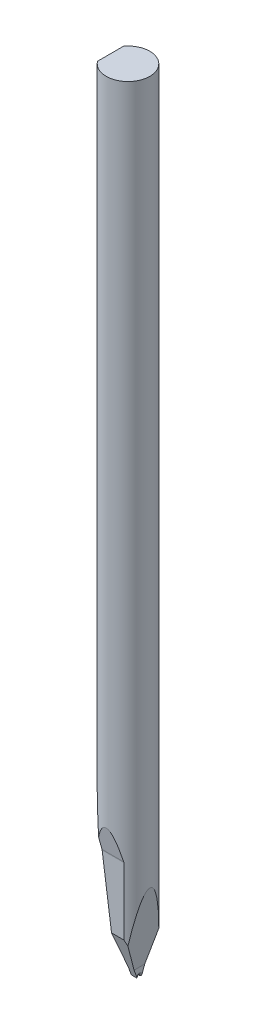
ISO-10303-21;
HEADER;
FILE_DESCRIPTION(('STEP AP214'),'2;1');
FILE_NAME('part.step','',(''),(''),'','','');
FILE_SCHEMA(('AUTOMOTIVE_DESIGN { 1 0 10303 214 1 1 1 1 }'));
ENDSEC;
DATA;
#1=APPLICATION_CONTEXT('core data for automotive mechanical design processes');
#2=APPLICATION_PROTOCOL_DEFINITION('international standard','automotive_design',2000,#1);
#3=PRODUCT_CONTEXT('',#1,'mechanical');
#4=PRODUCT('Part','Part','',(#3));
#5=PRODUCT_RELATED_PRODUCT_CATEGORY('part','',(#4));
#6=PRODUCT_DEFINITION_FORMATION('','',#4);
#7=PRODUCT_DEFINITION_CONTEXT('part definition',#1,'design');
#8=PRODUCT_DEFINITION('design','',#6,#7);
#9=PRODUCT_DEFINITION_SHAPE('','',#8);
#10=(LENGTH_UNIT() NAMED_UNIT(*) SI_UNIT(.MILLI.,.METRE.));
#11=(NAMED_UNIT(*) PLANE_ANGLE_UNIT() SI_UNIT($,.RADIAN.));
#12=(NAMED_UNIT(*) SI_UNIT($,.STERADIAN.) SOLID_ANGLE_UNIT());
#13=UNCERTAINTY_MEASURE_WITH_UNIT(LENGTH_MEASURE(1.E-05),#10,'distance_accuracy_value','');
#14=(GEOMETRIC_REPRESENTATION_CONTEXT(3) GLOBAL_UNCERTAINTY_ASSIGNED_CONTEXT((#13)) GLOBAL_UNIT_ASSIGNED_CONTEXT((#10,
#11,#12)) REPRESENTATION_CONTEXT('',''));
#15=CARTESIAN_POINT('',(0.,0.,0.));
#16=DIRECTION('',(0.,0.,1.));
#17=DIRECTION('',(1.,0.,0.));
#18=AXIS2_PLACEMENT_3D('',#15,#16,#17);
#19=CARTESIAN_POINT('',(0.,0.,0.));
#20=DIRECTION('',(0.,1.,0.));
#21=DIRECTION('',(0.,0.,1.));
#22=AXIS2_PLACEMENT_3D('',#19,#20,#21);
#23=PLANE('',#22);
#24=DIRECTION('',(-1.,0.,0.));
#25=VECTOR('',#24,1.);
#26=CARTESIAN_POINT('',(2.00770998,0.,-0.19939));
#27=LINE('',#26,#25);
#28=CARTESIAN_POINT('',(0.994405422545101,0.,-0.19939));
#29=VERTEX_POINT('',#28);
#30=CARTESIAN_POINT('',(0.512985729992795,0.,-0.19939));
#31=VERTEX_POINT('',#30);
#32=EDGE_CURVE('E250',#29,#31,#27,.T.);
#33=ORIENTED_EDGE('',*,*,#32,.F.);
#34=CARTESIAN_POINT('',(0.84709,0.,-0.365713994150245));
#35=DIRECTION('',(0.,1.,0.));
#36=DIRECTION('',(0.,0.,-1.));
#37=AXIS2_PLACEMENT_3D('',#34,#35,#36);
#38=ELLIPSE('',#37,0.244960628980874,0.20066);
#39=CARTESIAN_POINT('',(0.84709,0.,-0.120753365169372));
#40=VERTEX_POINT('',#39);
#41=EDGE_CURVE('E410',#29,#40,#38,.F.);
#42=ORIENTED_EDGE('',*,*,#41,.T.);
#43=CARTESIAN_POINT('',(0.84709,0.,-0.120753365169372));
#44=DIRECTION('',(-1.,0.,0.));
#45=VECTOR('',#44,1.);
#46=LINE('',#43,#45);
#47=CARTESIAN_POINT('',(0.60579,0.,-0.120753365169372));
#48=VERTEX_POINT('',#47);
#49=EDGE_CURVE('E458',#40,#48,#46,.T.);
#50=ORIENTED_EDGE('',*,*,#49,.T.);
#51=CARTESIAN_POINT('',(0.60579,0.,-0.241683295932081));
#52=DIRECTION('',(0.,1.,0.));
#53=DIRECTION('',(0.,0.,1.));
#54=AXIS2_PLACEMENT_3D('',#51,#52,#53);
#55=ELLIPSE('',#54,0.12092993076271,0.09906);
#56=EDGE_CURVE('E413',#48,#31,#55,.F.);
#57=ORIENTED_EDGE('',*,*,#56,.T.);
#58=EDGE_LOOP('',(#33,#42,#50,#57));
#59=FACE_BOUND('',#58,.T.);
#60=ADVANCED_FACE('F41',(#59),#23,.F.);
#61=CARTESIAN_POINT('',(0.,72.009,0.));
#62=DIRECTION('',(0.,-1.,0.));
#63=DIRECTION('',(0.,0.,-1.));
#64=AXIS2_PLACEMENT_3D('',#61,#62,#63);
#65=CYLINDRICAL_SURFACE('',#64,1.99771);
#66=CARTESIAN_POINT('',(0.,4.39551129942374,0.));
#67=DIRECTION('',(-0.99026806874157,-0.139173100960066,0.));
#68=DIRECTION('',(0.139173100960066,-0.99026806874157,0.));
#69=AXIS2_PLACEMENT_3D('',#66,#67,#68);
#70=ELLIPSE('',#69,14.3541387395918,1.99771);
#71=CARTESIAN_POINT('',(-0.929666327093164,11.0104309351425,1.76820976254773));
#72=VERTEX_POINT('',#71);
#73=CARTESIAN_POINT('',(-1.60147,15.7905624487303,1.19421065277446));
#74=VERTEX_POINT('',#73);
#75=EDGE_CURVE('E260',#72,#74,#70,.T.);
#76=ORIENTED_EDGE('',*,*,#75,.F.);
#77=CARTESIAN_POINT('',(0.,0.982415055535091,0.));
#78=DIRECTION('',(0.,-0.173648177666931,0.984807753012208));
#79=DIRECTION('',(0.,-0.984807753012208,-0.173648177666931));
#80=AXIS2_PLACEMENT_3D('',#77,#78,#79);
#81=ELLIPSE('',#80,11.5043533818808,1.99771);
#82=CARTESIAN_POINT('',(1.20429720645774,10.0218645165918,1.5938988307349));
#83=VERTEX_POINT('',#82);
#84=EDGE_CURVE('E209',#83,#72,#81,.T.);
#85=ORIENTED_EDGE('',*,*,#84,.F.);
#86=CARTESIAN_POINT('',(1.20938746582723,9.97775787946442,1.59004));
#87=CARTESIAN_POINT('',(1.2093768707074,9.98526109536694,1.59004964802325));
#88=CARTESIAN_POINT('',(1.20894738488989,9.99268825631315,1.59037604124522));
#89=CARTESIAN_POINT('',(1.20725063181282,10.0073904686973,1.59166231812201));
#90=CARTESIAN_POINT('',(1.20598336450717,10.0146655201269,1.59262220181167));
#91=CARTESIAN_POINT('',(1.20429720645774,10.0218645165918,1.5938988307349));
#92=B_SPLINE_CURVE_WITH_KNOTS('',3,(#86,#87,#88,#89,#90,#91),.UNSPECIFIED.,.F.,.F.,(4,2,4),(0.,
0.0223401744154467,0.0446803500598775),.UNSPECIFIED.);
#93=CARTESIAN_POINT('',(1.20938746582723,9.97775787946442,1.59004));
#94=VERTEX_POINT('',#93);
#95=EDGE_CURVE('E200',#94,#83,#92,.T.);
#96=ORIENTED_EDGE('',*,*,#95,.F.);
#97=DIRECTION('',(0.,-1.,0.));
#98=VECTOR('',#97,1.);
#99=CARTESIAN_POINT('',(1.20938746582723,72.009,1.59004));
#100=LINE('',#99,#98);
#101=CARTESIAN_POINT('',(1.20938746582723,3.82077947336456,1.59004));
#102=VERTEX_POINT('',#101);
#103=EDGE_CURVE('E280',#102,#94,#100,.F.);
#104=ORIENTED_EDGE('',*,*,#103,.F.);
#105=CARTESIAN_POINT('',(0.,-0.547819522665055,0.));
#106=DIRECTION('',(0.,-0.342020143325669,0.939692620785908));
#107=DIRECTION('',(0.,-0.939692620785908,-0.342020143325669));
#108=AXIS2_PLACEMENT_3D('',#105,#106,#107);
#109=ELLIPSE('',#108,5.84091328824979,1.99771);
#110=CARTESIAN_POINT('',(1.40724633601307,3.3478893445756,1.41792206904251));
#111=VERTEX_POINT('',#110);
#112=EDGE_CURVE('E263',#111,#102,#109,.T.);
#113=ORIENTED_EDGE('',*,*,#112,.F.);
#114=CARTESIAN_POINT('',(0.,-6.66518862662843,0.));
#115=DIRECTION('',(0.990268068741571,-0.139173100960058,0.));
#116=DIRECTION('',(-0.139173100960058,-0.990268068741571,0.));
#117=AXIS2_PLACEMENT_3D('',#114,#115,#116);
#118=ELLIPSE('',#117,14.3541387395926,1.99771);
#119=CARTESIAN_POINT('',(1.40724633601307,3.3478893445756,-1.41792206904251));
#120=VERTEX_POINT('',#119);
#121=EDGE_CURVE('E278',#120,#111,#118,.T.);
#122=ORIENTED_EDGE('',*,*,#121,.F.);
#123=CARTESIAN_POINT('',(0.,-0.547819522665055,0.));
#124=DIRECTION('',(0.,-0.342020143325669,-0.939692620785908));
#125=DIRECTION('',(0.,-0.939692620785908,0.342020143325669));
#126=AXIS2_PLACEMENT_3D('',#123,#124,#125);
#127=ELLIPSE('',#126,5.84091328824979,1.99771);
#128=CARTESIAN_POINT('',(1.20938746582723,3.82077947336456,-1.59004));
#129=VERTEX_POINT('',#128);
#130=EDGE_CURVE('E261',#129,#120,#127,.T.);
#131=ORIENTED_EDGE('',*,*,#130,.F.);
#132=DIRECTION('',(0.,-1.,0.));
#133=VECTOR('',#132,1.);
#134=CARTESIAN_POINT('',(1.20938746582723,72.009,-1.59004));
#135=LINE('',#134,#133);
#136=CARTESIAN_POINT('',(1.20938746582723,9.97775787946442,-1.59004));
#137=VERTEX_POINT('',#136);
#138=EDGE_CURVE('E282',#137,#129,#135,.T.);
#139=ORIENTED_EDGE('',*,*,#138,.F.);
#140=CARTESIAN_POINT('',(1.20429720645774,10.0218645165918,-1.5938988307349));
#141=CARTESIAN_POINT('',(1.20598336450717,10.0146655201269,-1.59262220181167));
#142=CARTESIAN_POINT('',(1.20725063181282,10.0073904686973,-1.59166231812201));
#143=CARTESIAN_POINT('',(1.20894738488989,9.99268825631315,-1.59037604124523));
#144=CARTESIAN_POINT('',(1.2093768707074,9.98526109536695,-1.59004964802325));
#145=CARTESIAN_POINT('',(1.20938746582723,9.97775787946442,-1.59004));
#146=B_SPLINE_CURVE_WITH_KNOTS('',3,(#140,#141,#142,#143,#144,#145),.UNSPECIFIED.,.F.,.F.,(4,2,
4),(0.,0.022340175644429,0.0446803500598758),.UNSPECIFIED.);
#147=CARTESIAN_POINT('',(1.20429720645774,10.0218645165918,-1.5938988307349));
#148=VERTEX_POINT('',#147);
#149=EDGE_CURVE('E291',#148,#137,#146,.T.);
#150=ORIENTED_EDGE('',*,*,#149,.F.);
#151=CARTESIAN_POINT('',(0.,0.982415055535091,0.));
#152=DIRECTION('',(0.,-0.173648177666931,-0.984807753012208));
#153=DIRECTION('',(0.,-0.984807753012208,0.173648177666931));
#154=AXIS2_PLACEMENT_3D('',#151,#152,#153);
#155=ELLIPSE('',#154,11.5043533818808,1.99771);
#156=CARTESIAN_POINT('',(-0.929666327093164,11.0104309351425,-1.76820976254773));
#157=VERTEX_POINT('',#156);
#158=EDGE_CURVE('E524',#157,#148,#155,.T.);
#159=ORIENTED_EDGE('',*,*,#158,.F.);
#160=CARTESIAN_POINT('',(-1.60147,15.7905624487303,-1.19421065277446));
#161=VERTEX_POINT('',#160);
#162=EDGE_CURVE('E212',#161,#157,#70,.T.);
#163=ORIENTED_EDGE('',*,*,#162,.F.);
#164=DIRECTION('',(0.,-1.,0.));
#165=VECTOR('',#164,1.);
#166=CARTESIAN_POINT('',(-1.60147,72.009,-1.19421065277446));
#167=LINE('',#166,#165);
#168=CARTESIAN_POINT('',(-1.60147,72.009,-1.19421065277446));
#169=VERTEX_POINT('',#168);
#170=EDGE_CURVE('E269',#169,#161,#167,.T.);
#171=ORIENTED_EDGE('',*,*,#170,.F.);
#172=CARTESIAN_POINT('',(0.,72.009,0.));
#173=DIRECTION('',(0.,1.,0.));
#174=DIRECTION('',(0.,0.,1.));
#175=AXIS2_PLACEMENT_3D('',#172,#173,#174);
#176=CIRCLE('',#175,1.99771);
#177=CARTESIAN_POINT('',(-1.60147,72.009,1.19421065277446));
#178=VERTEX_POINT('',#177);
#179=EDGE_CURVE('E272',#178,#169,#176,.T.);
#180=ORIENTED_EDGE('',*,*,#179,.F.);
#181=DIRECTION('',(0.,-1.,0.));
#182=VECTOR('',#181,1.);
#183=CARTESIAN_POINT('',(-1.60147,72.009,1.19421065277446));
#184=LINE('',#183,#182);
#185=EDGE_CURVE('E267',#74,#178,#184,.F.);
#186=ORIENTED_EDGE('',*,*,#185,.F.);
#187=EDGE_LOOP('',(#76,#85,#96,#104,#113,#122,#131,#139,#150,#159,#163,#171,#180,#186));
#188=FACE_BOUND('',#187,.T.);
#189=ADVANCED_FACE('F298',(#188),#65,.T.);
#190=CARTESIAN_POINT('',(-1.60147,72.009,2.00770998));
#191=DIRECTION('',(-1.,0.,0.));
#192=DIRECTION('',(0.,0.,1.));
#193=AXIS2_PLACEMENT_3D('',#190,#191,#192);
#194=PLANE('',#193);
#195=ORIENTED_EDGE('',*,*,#170,.T.);
#196=DIRECTION('',(0.,0.,1.));
#197=VECTOR('',#196,1.);
#198=CARTESIAN_POINT('',(-1.60147,15.7905624487303,2.00770998));
#199=LINE('',#198,#197);
#200=EDGE_CURVE('E275',#161,#74,#199,.T.);
#201=ORIENTED_EDGE('',*,*,#200,.T.);
#202=ORIENTED_EDGE('',*,*,#185,.T.);
#203=DIRECTION('',(0.,0.,-1.));
#204=VECTOR('',#203,1.);
#205=CARTESIAN_POINT('',(-1.60147,72.009,2.00770998));
#206=LINE('',#205,#204);
#207=EDGE_CURVE('E265',#178,#169,#206,.T.);
#208=ORIENTED_EDGE('',*,*,#207,.T.);
#209=EDGE_LOOP('',(#195,#201,#202,#208));
#210=FACE_BOUND('',#209,.T.);
#211=ADVANCED_FACE('F332',(#210),#194,.T.);
#212=CARTESIAN_POINT('',(0.,72.009,0.));
#213=DIRECTION('',(0.,1.,0.));
#214=DIRECTION('',(0.,0.,1.));
#215=AXIS2_PLACEMENT_3D('',#212,#213,#214);
#216=PLANE('',#215);
#217=ORIENTED_EDGE('',*,*,#179,.T.);
#218=ORIENTED_EDGE('',*,*,#207,.F.);
#219=EDGE_LOOP('',(#217,#218));
#220=FACE_BOUND('',#219,.T.);
#221=ADVANCED_FACE('F322',(#220),#216,.T.);
#222=CARTESIAN_POINT('',(2.00770998,-0.00999998000000006,-1.59004));
#223=DIRECTION('',(0.,0.,-1.));
#224=DIRECTION('',(-1.,0.,0.));
#225=AXIS2_PLACEMENT_3D('',#222,#223,#224);
#226=PLANE('',#225);
#227=ORIENTED_EDGE('',*,*,#138,.T.);
#228=DIRECTION('',(-1.,0.,0.));
#229=VECTOR('',#228,1.);
#230=CARTESIAN_POINT('',(2.00770998,3.82077947336456,-1.59004));
#231=LINE('',#230,#229);
#232=CARTESIAN_POINT('',(0.0807732905643867,3.82077947336456,-1.59004));
#233=VERTEX_POINT('',#232);
#234=EDGE_CURVE('E252',#129,#233,#231,.T.);
#235=ORIENTED_EDGE('',*,*,#234,.T.);
#236=DIRECTION('',(-0.139173100960066,0.99026806874157,0.));
#237=VECTOR('',#236,1.);
#238=CARTESIAN_POINT('',(0.64604937987762,-0.201368897322559,-1.59004));
#239=LINE('',#238,#237);
#240=CARTESIAN_POINT('',(-0.78453359387349,9.97775787946442,-1.59004));
#241=VERTEX_POINT('',#240);
#242=EDGE_CURVE('E237',#233,#241,#239,.T.);
#243=ORIENTED_EDGE('',*,*,#242,.T.);
#244=DIRECTION('',(-1.,0.,0.));
#245=VECTOR('',#244,1.);
#246=CARTESIAN_POINT('',(2.00770998,9.97775787946442,-1.59004));
#247=LINE('',#246,#245);
#248=EDGE_CURVE('E254',#137,#241,#247,.T.);
#249=ORIENTED_EDGE('',*,*,#248,.F.);
#250=EDGE_LOOP('',(#227,#235,#243,#249));
#251=FACE_BOUND('',#250,.T.);
#252=ADVANCED_FACE('F320',(#251),#226,.T.);
#253=CARTESIAN_POINT('',(2.00770998,-0.00999998000000006,1.59004));
#254=DIRECTION('',(0.,0.,1.));
#255=DIRECTION('',(1.,0.,0.));
#256=AXIS2_PLACEMENT_3D('',#253,#254,#255);
#257=PLANE('',#256);
#258=ORIENTED_EDGE('',*,*,#103,.T.);
#259=DIRECTION('',(-1.,0.,0.));
#260=VECTOR('',#259,1.);
#261=CARTESIAN_POINT('',(2.00770998,9.97775787946442,1.59004));
#262=LINE('',#261,#260);
#263=CARTESIAN_POINT('',(-0.78453359387349,9.97775787946442,1.59004));
#264=VERTEX_POINT('',#263);
#265=EDGE_CURVE('E204',#94,#264,#262,.T.);
#266=ORIENTED_EDGE('',*,*,#265,.T.);
#267=DIRECTION('',(0.139173100960066,-0.99026806874157,0.));
#268=VECTOR('',#267,1.);
#269=CARTESIAN_POINT('',(0.64604937987762,-0.201368897322559,1.59004));
#270=LINE('',#269,#268);
#271=CARTESIAN_POINT('',(0.0807732905643869,3.82077947336456,1.59004));
#272=VERTEX_POINT('',#271);
#273=EDGE_CURVE('E219',#264,#272,#270,.T.);
#274=ORIENTED_EDGE('',*,*,#273,.T.);
#275=DIRECTION('',(-1.,0.,0.));
#276=VECTOR('',#275,1.);
#277=CARTESIAN_POINT('',(2.00770998,3.82077947336456,1.59004));
#278=LINE('',#277,#276);
#279=EDGE_CURVE('E213',#102,#272,#278,.T.);
#280=ORIENTED_EDGE('',*,*,#279,.F.);
#281=EDGE_LOOP('',(#258,#266,#274,#280));
#282=FACE_BOUND('',#281,.T.);
#283=ADVANCED_FACE('F307',(#282),#257,.T.);
#284=CARTESIAN_POINT('',(2.00770998,10.0218645165918,-1.5938988307349));
#285=DIRECTION('',(0.,-0.173648177666931,-0.984807753012208));
#286=DIRECTION('',(0.,0.984807753012208,-0.173648177666931));
#287=AXIS2_PLACEMENT_3D('',#284,#285,#286);
#288=PLANE('',#287);
#289=ORIENTED_EDGE('',*,*,#158,.T.);
#290=DIRECTION('',(-1.,0.,0.));
#291=VECTOR('',#290,1.);
#292=CARTESIAN_POINT('',(2.00770998,10.0218645165918,-1.5938988307349));
#293=LINE('',#292,#291);
#294=CARTESIAN_POINT('',(-0.79073237747129,10.0218645165918,-1.5938988307349));
#295=VERTEX_POINT('',#294);
#296=EDGE_CURVE('E256',#148,#295,#293,.T.);
#297=ORIENTED_EDGE('',*,*,#296,.T.);
#298=DIRECTION('',(-0.137098791054065,0.975508586841573,-0.172008483772957));
#299=VECTOR('',#298,1.);
#300=CARTESIAN_POINT('',(-0.738132635218786,9.64759790316314,-1.52790552880904));
#301=LINE('',#300,#299);
#302=EDGE_CURVE('E234',#295,#157,#301,.T.);
#303=ORIENTED_EDGE('',*,*,#302,.T.);
#304=EDGE_LOOP('',(#289,#297,#303));
#305=FACE_BOUND('',#304,.T.);
#306=ADVANCED_FACE('F327',(#305),#288,.T.);
#307=CARTESIAN_POINT('',(2.00770998,9.97775787946442,-1.84404));
#308=DIRECTION('',(-1.,0.,0.));
#309=DIRECTION('',(0.,0.,1.));
#310=AXIS2_PLACEMENT_3D('',#307,#308,#309);
#311=CYLINDRICAL_SURFACE('',#310,0.254);
#312=ORIENTED_EDGE('',*,*,#149,.T.);
#313=ORIENTED_EDGE('',*,*,#248,.T.);
#314=CARTESIAN_POINT('',(-0.784533593873489,9.97775787946442,-1.84404));
#315=DIRECTION('',(-0.99026806874157,-0.139173100960066,0.));
#316=DIRECTION('',(-0.139173100960066,0.99026806874157,0.));
#317=AXIS2_PLACEMENT_3D('',#314,#315,#316);
#318=ELLIPSE('',#317,0.256496203419729,0.254);
#319=EDGE_CURVE('E231',#241,#295,#318,.T.);
#320=ORIENTED_EDGE('',*,*,#319,.T.);
#321=ORIENTED_EDGE('',*,*,#296,.F.);
#322=EDGE_LOOP('',(#312,#313,#320,#321));
#323=FACE_BOUND('',#322,.T.);
#324=ADVANCED_FACE('F306',(#323),#311,.F.);
#325=CARTESIAN_POINT('',(2.00770998,9.97775787946442,1.84404));
#326=DIRECTION('',(-1.,0.,0.));
#327=DIRECTION('',(0.,0.,1.));
#328=AXIS2_PLACEMENT_3D('',#325,#326,#327);
#329=CYLINDRICAL_SURFACE('',#328,0.254);
#330=ORIENTED_EDGE('',*,*,#95,.T.);
#331=DIRECTION('',(-1.,0.,0.));
#332=VECTOR('',#331,1.);
#333=CARTESIAN_POINT('',(2.00770998,10.0218645165918,1.5938988307349));
#334=LINE('',#333,#332);
#335=CARTESIAN_POINT('',(-0.79073237747129,10.0218645165918,1.5938988307349));
#336=VERTEX_POINT('',#335);
#337=EDGE_CURVE('E193',#83,#336,#334,.T.);
#338=ORIENTED_EDGE('',*,*,#337,.T.);
#339=CARTESIAN_POINT('',(-0.784533593873489,9.97775787946442,1.84404));
#340=DIRECTION('',(-0.99026806874157,-0.139173100960066,0.));
#341=DIRECTION('',(-0.139173100960066,0.99026806874157,0.));
#342=AXIS2_PLACEMENT_3D('',#339,#340,#341);
#343=ELLIPSE('',#342,0.256496203419729,0.254);
#344=EDGE_CURVE('E198',#336,#264,#343,.T.);
#345=ORIENTED_EDGE('',*,*,#344,.T.);
#346=ORIENTED_EDGE('',*,*,#265,.F.);
#347=EDGE_LOOP('',(#330,#338,#345,#346));
#348=FACE_BOUND('',#347,.T.);
#349=ADVANCED_FACE('F195',(#348),#329,.F.);
#350=CARTESIAN_POINT('',(2.00770998,10.0218645165918,1.5938988307349));
#351=DIRECTION('',(0.,-0.173648177666931,0.984807753012208));
#352=DIRECTION('',(0.,-0.984807753012208,-0.173648177666931));
#353=AXIS2_PLACEMENT_3D('',#350,#351,#352);
#354=PLANE('',#353);
#355=ORIENTED_EDGE('',*,*,#84,.T.);
#356=DIRECTION('',(0.137098791054065,-0.975508586841573,-0.172008483772957));
#357=VECTOR('',#356,1.);
#358=CARTESIAN_POINT('',(-0.738132635218786,9.64759790316314,1.52790552880904));
#359=LINE('',#358,#357);
#360=EDGE_CURVE('E207',#72,#336,#359,.T.);
#361=ORIENTED_EDGE('',*,*,#360,.T.);
#362=ORIENTED_EDGE('',*,*,#337,.F.);
#363=EDGE_LOOP('',(#355,#361,#362));
#364=FACE_BOUND('',#363,.T.);
#365=ADVANCED_FACE('F208',(#364),#354,.T.);
#366=CARTESIAN_POINT('',(1.04775,0.78994,2.00770998));
#367=DIRECTION('',(0.990268068741571,-0.139173100960058,0.));
#368=DIRECTION('',(0.139173100960058,0.990268068741571,0.));
#369=AXIS2_PLACEMENT_3D('',#366,#367,#368);
#370=PLANE('',#369);
#371=ORIENTED_EDGE('',*,*,#121,.T.);
#372=DIRECTION('',(0.130928346226655,0.931603590543026,0.339075977093181));
#373=VECTOR('',#372,1.);
#374=CARTESIAN_POINT('',(0.955090140045963,0.130630838002654,0.246935736710216));
#375=LINE('',#374,#373);
#376=CARTESIAN_POINT('',(1.04775,0.78994,0.486904646856244));
#377=VERTEX_POINT('',#376);
#378=EDGE_CURVE('E225',#377,#111,#375,.T.);
#379=ORIENTED_EDGE('',*,*,#378,.F.);
#380=DIRECTION('',(0.,0.,-1.));
#381=VECTOR('',#380,1.);
#382=CARTESIAN_POINT('',(1.04775,0.78994,2.00770998));
#383=LINE('',#382,#381);
#384=CARTESIAN_POINT('',(1.04775,0.78994,-0.486904646856244));
#385=VERTEX_POINT('',#384);
#386=EDGE_CURVE('E476',#377,#385,#383,.T.);
#387=ORIENTED_EDGE('',*,*,#386,.T.);
#388=DIRECTION('',(-0.130928346226655,-0.931603590543026,0.339075977093181));
#389=VECTOR('',#388,1.);
#390=CARTESIAN_POINT('',(0.955090140045963,0.130630838002654,-0.246935736710216));
#391=LINE('',#390,#389);
#392=EDGE_CURVE('E474',#120,#385,#391,.T.);
#393=ORIENTED_EDGE('',*,*,#392,.F.);
#394=EDGE_LOOP('',(#371,#379,#387,#393));
#395=FACE_BOUND('',#394,.T.);
#396=ADVANCED_FACE('F311',(#395),#370,.T.);
#397=CARTESIAN_POINT('',(2.00770998,0.,0.19939));
#398=DIRECTION('',(0.,-0.342020143325669,0.939692620785908));
#399=DIRECTION('',(0.,-0.939692620785908,-0.342020143325669));
#400=AXIS2_PLACEMENT_3D('',#397,#398,#399);
#401=PLANE('',#400);
#402=DIRECTION('',(-1.,0.,0.));
#403=VECTOR('',#402,1.);
#404=CARTESIAN_POINT('',(2.00770998,0.,0.19939));
#405=LINE('',#404,#403);
#406=CARTESIAN_POINT('',(0.994405422545101,0.,0.19939));
#407=VERTEX_POINT('',#406);
#408=CARTESIAN_POINT('',(0.512985729992794,0.,0.19939));
#409=VERTEX_POINT('',#408);
#410=EDGE_CURVE('E203',#407,#409,#405,.T.);
#411=ORIENTED_EDGE('',*,*,#410,.F.);
#412=CARTESIAN_POINT('',(0.84709,0.156293429962624,0.256276156317765));
#413=DIRECTION('',(0.,-0.342020143325669,0.939692620785908));
#414=DIRECTION('',(0.,0.939692620785908,0.342020143325669));
#415=AXIS2_PLACEMENT_3D('',#412,#413,#414);
#416=ELLIPSE('',#415,0.244960628980874,0.20066);
#417=CARTESIAN_POINT('',(1.04775,0.156293429962624,0.256276156317765));
#418=VERTEX_POINT('',#417);
#419=EDGE_CURVE('E50',#407,#418,#416,.T.);
#420=ORIENTED_EDGE('',*,*,#419,.T.);
#421=DIRECTION('',(0.,0.939692620785908,0.342020143325669));
#422=VECTOR('',#421,1.);
#423=CARTESIAN_POINT('',(1.04775,0.,0.19939));
#424=LINE('',#423,#422);
#425=EDGE_CURVE('E475',#418,#377,#424,.T.);
#426=ORIENTED_EDGE('',*,*,#425,.T.);
#427=ORIENTED_EDGE('',*,*,#378,.T.);
#428=ORIENTED_EDGE('',*,*,#112,.T.);
#429=ORIENTED_EDGE('',*,*,#279,.T.);
#430=DIRECTION('',(0.130928346226662,-0.931603590543025,-0.339075977093181));
#431=VECTOR('',#430,1.);
#432=CARTESIAN_POINT('',(0.641575863306582,-0.16953817296041,0.137683151470536));
#433=LINE('',#432,#431);
#434=CARTESIAN_POINT('',(0.50673,0.78994,0.486904646856245));
#435=VERTEX_POINT('',#434);
#436=EDGE_CURVE('E222',#272,#435,#433,.T.);
#437=ORIENTED_EDGE('',*,*,#436,.T.);
#438=DIRECTION('',(0.,-0.939692620785908,-0.342020143325669));
#439=VECTOR('',#438,1.);
#440=CARTESIAN_POINT('',(0.50673,0.,0.19939));
#441=LINE('',#440,#439);
#442=CARTESIAN_POINT('',(0.50673,0.0397426980960916,0.213855159136405));
#443=VERTEX_POINT('',#442);
#444=EDGE_CURVE('E245',#435,#443,#441,.T.);
#445=ORIENTED_EDGE('',*,*,#444,.T.);
#446=CARTESIAN_POINT('',(0.60579,0.0397426980960916,0.213855159136405));
#447=DIRECTION('',(0.,-0.342020143325669,0.939692620785908));
#448=DIRECTION('',(0.,-0.939692620785908,-0.342020143325669));
#449=AXIS2_PLACEMENT_3D('',#446,#447,#448);
#450=ELLIPSE('',#449,0.12092993076271,0.09906);
#451=EDGE_CURVE('E497',#443,#409,#450,.T.);
#452=ORIENTED_EDGE('',*,*,#451,.T.);
#453=EDGE_LOOP('',(#411,#420,#426,#427,#428,#429,#437,#445,#452));
#454=FACE_BOUND('',#453,.T.);
#455=ADVANCED_FACE('F312',(#454),#401,.T.);
#456=CARTESIAN_POINT('',(2.00770998,0.,-0.19939));
#457=DIRECTION('',(0.,-0.342020143325669,-0.939692620785908));
#458=DIRECTION('',(0.,0.939692620785908,-0.342020143325669));
#459=AXIS2_PLACEMENT_3D('',#456,#457,#458);
#460=PLANE('',#459);
#461=DIRECTION('',(0.,-0.939692620785908,0.342020143325669));
#462=VECTOR('',#461,1.);
#463=CARTESIAN_POINT('',(1.04775,0.,-0.19939));
#464=LINE('',#463,#462);
#465=CARTESIAN_POINT('',(1.04775,0.156293429962624,-0.256276156317765));
#466=VERTEX_POINT('',#465);
#467=EDGE_CURVE('E471',#385,#466,#464,.T.);
#468=ORIENTED_EDGE('',*,*,#467,.T.);
#469=CARTESIAN_POINT('',(0.84709,0.156293429962624,-0.256276156317765));
#470=DIRECTION('',(0.,-0.342020143325669,-0.939692620785908));
#471=DIRECTION('',(0.,-0.939692620785908,0.342020143325669));
#472=AXIS2_PLACEMENT_3D('',#469,#470,#471);
#473=ELLIPSE('',#472,0.244960628980874,0.20066);
#474=EDGE_CURVE('E420',#466,#29,#473,.T.);
#475=ORIENTED_EDGE('',*,*,#474,.T.);
#476=ORIENTED_EDGE('',*,*,#32,.T.);
#477=CARTESIAN_POINT('',(0.60579,0.0397426980960917,-0.213855159136405));
#478=DIRECTION('',(0.,-0.342020143325669,-0.939692620785908));
#479=DIRECTION('',(0.,0.939692620785908,-0.342020143325669));
#480=AXIS2_PLACEMENT_3D('',#477,#478,#479);
#481=ELLIPSE('',#480,0.12092993076271,0.09906);
#482=CARTESIAN_POINT('',(0.50673,0.0397426980960916,-0.213855159136405));
#483=VERTEX_POINT('',#482);
#484=EDGE_CURVE('E454',#31,#483,#481,.T.);
#485=ORIENTED_EDGE('',*,*,#484,.T.);
#486=DIRECTION('',(0.,0.939692620785908,-0.342020143325669));
#487=VECTOR('',#486,1.);
#488=CARTESIAN_POINT('',(0.50673,0.,-0.19939));
#489=LINE('',#488,#487);
#490=CARTESIAN_POINT('',(0.50673,0.78994,-0.486904646856245));
#491=VERTEX_POINT('',#490);
#492=EDGE_CURVE('E243',#483,#491,#489,.T.);
#493=ORIENTED_EDGE('',*,*,#492,.T.);
#494=DIRECTION('',(-0.130928346226662,0.931603590543025,-0.339075977093181));
#495=VECTOR('',#494,1.);
#496=CARTESIAN_POINT('',(0.641575863306582,-0.16953817296041,-0.137683151470536));
#497=LINE('',#496,#495);
#498=EDGE_CURVE('E240',#491,#233,#497,.T.);
#499=ORIENTED_EDGE('',*,*,#498,.T.);
#500=ORIENTED_EDGE('',*,*,#234,.F.);
#501=ORIENTED_EDGE('',*,*,#130,.T.);
#502=ORIENTED_EDGE('',*,*,#392,.T.);
#503=EDGE_LOOP('',(#468,#475,#476,#485,#493,#499,#500,#501,#502));
#504=FACE_BOUND('',#503,.T.);
#505=ADVANCED_FACE('F315',(#504),#460,.T.);
#506=CARTESIAN_POINT('',(0.50673,0.78994,2.00770998));
#507=DIRECTION('',(-0.99026806874157,-0.139173100960066,0.));
#508=DIRECTION('',(0.139173100960066,-0.99026806874157,0.));
#509=AXIS2_PLACEMENT_3D('',#506,#507,#508);
#510=PLANE('',#509);
#511=ORIENTED_EDGE('',*,*,#75,.T.);
#512=ORIENTED_EDGE('',*,*,#200,.F.);
#513=ORIENTED_EDGE('',*,*,#162,.T.);
#514=ORIENTED_EDGE('',*,*,#302,.F.);
#515=ORIENTED_EDGE('',*,*,#319,.F.);
#516=ORIENTED_EDGE('',*,*,#242,.F.);
#517=ORIENTED_EDGE('',*,*,#498,.F.);
#518=DIRECTION('',(0.,0.,-1.));
#519=VECTOR('',#518,1.);
#520=CARTESIAN_POINT('',(0.50673,0.78994,2.00770998));
#521=LINE('',#520,#519);
#522=EDGE_CURVE('E220',#435,#491,#521,.T.);
#523=ORIENTED_EDGE('',*,*,#522,.F.);
#524=ORIENTED_EDGE('',*,*,#436,.F.);
#525=ORIENTED_EDGE('',*,*,#273,.F.);
#526=ORIENTED_EDGE('',*,*,#344,.F.);
#527=ORIENTED_EDGE('',*,*,#360,.F.);
#528=EDGE_LOOP('',(#511,#512,#513,#514,#515,#516,#517,#523,#524,#525,#526,#527));
#529=FACE_BOUND('',#528,.T.);
#530=ADVANCED_FACE('F216',(#529),#510,.T.);
#531=CARTESIAN_POINT('',(0.50673,0.77994002,2.00770998));
#532=DIRECTION('',(-1.,0.,0.));
#533=DIRECTION('',(0.,-1.,0.));
#534=AXIS2_PLACEMENT_3D('',#531,#532,#533);
#535=PLANE('',#534);
#536=CARTESIAN_POINT('',(0.50673,0.1016,0.));
#537=DIRECTION('',(-1.,0.,0.));
#538=DIRECTION('',(0.,-1.,0.));
#539=AXIS2_PLACEMENT_3D('',#536,#537,#538);
#540=CIRCLE('',#539,0.1397);
#541=CARTESIAN_POINT('',(0.50673,0.181728628158241,-0.114435540587172));
#542=VERTEX_POINT('',#541);
#543=CARTESIAN_POINT('',(0.50673,0.181728628158241,0.114435540587172));
#544=VERTEX_POINT('',#543);
#545=EDGE_CURVE('E504',#542,#544,#540,.F.);
#546=ORIENTED_EDGE('',*,*,#545,.T.);
#547=DIRECTION('',(0.,0.819152044288993,-0.573576436351045));
#548=VECTOR('',#547,1.);
#549=CARTESIAN_POINT('',(0.50673,0.0568184817849346,0.201898566676639));
#550=LINE('',#549,#548);
#551=EDGE_CURVE('E494',#544,#443,#550,.F.);
#552=ORIENTED_EDGE('',*,*,#551,.T.);
#553=ORIENTED_EDGE('',*,*,#444,.F.);
#554=ORIENTED_EDGE('',*,*,#522,.T.);
#555=ORIENTED_EDGE('',*,*,#492,.F.);
#556=DIRECTION('',(0.,-0.819152044288992,-0.573576436351045));
#557=VECTOR('',#556,1.);
#558=CARTESIAN_POINT('',(0.50673,0.181728628158241,-0.114435540587172));
#559=LINE('',#558,#557);
#560=EDGE_CURVE('E520',#483,#542,#559,.F.);
#561=ORIENTED_EDGE('',*,*,#560,.T.);
#562=EDGE_LOOP('',(#546,#552,#553,#554,#555,#561));
#563=FACE_BOUND('',#562,.T.);
#564=ADVANCED_FACE('F394',(#563),#535,.T.);
#565=CARTESIAN_POINT('',(1.04775,-0.00999998,2.00770998));
#566=DIRECTION('',(1.,0.,0.));
#567=DIRECTION('',(0.,0.,-1.));
#568=AXIS2_PLACEMENT_3D('',#565,#566,#567);
#569=PLANE('',#568);
#570=CARTESIAN_POINT('',(1.04775,0.1016,0.));
#571=DIRECTION('',(1.,0.,0.));
#572=DIRECTION('',(0.,0.,-1.));
#573=AXIS2_PLACEMENT_3D('',#570,#571,#572);
#574=CIRCLE('',#573,0.2413);
#575=CARTESIAN_POINT('',(1.04775,0.240003994091507,0.197661388286934));
#576=VERTEX_POINT('',#575);
#577=CARTESIAN_POINT('',(1.04775,0.240003994091507,-0.197661388286934));
#578=VERTEX_POINT('',#577);
#579=EDGE_CURVE('E463',#576,#578,#574,.F.);
#580=ORIENTED_EDGE('',*,*,#579,.T.);
#581=DIRECTION('',(0.,0.819152044288992,0.573576436351045));
#582=VECTOR('',#581,1.);
#583=CARTESIAN_POINT('',(1.04775,0.115093847718201,-0.285124414376401));
#584=LINE('',#583,#582);
#585=EDGE_CURVE('E426',#578,#466,#584,.F.);
#586=ORIENTED_EDGE('',*,*,#585,.T.);
#587=ORIENTED_EDGE('',*,*,#467,.F.);
#588=ORIENTED_EDGE('',*,*,#386,.F.);
#589=ORIENTED_EDGE('',*,*,#425,.F.);
#590=DIRECTION('',(0.,-0.819152044288993,0.573576436351045));
#591=VECTOR('',#590,1.);
#592=CARTESIAN_POINT('',(1.04775,0.240003994091507,0.197661388286934));
#593=LINE('',#592,#591);
#594=EDGE_CURVE('E467',#418,#576,#593,.F.);
#595=ORIENTED_EDGE('',*,*,#594,.T.);
#596=EDGE_LOOP('',(#580,#586,#587,#588,#589,#595));
#597=FACE_BOUND('',#596,.T.);
#598=ADVANCED_FACE('F342',(#597),#569,.T.);
#599=CARTESIAN_POINT('',(0.60579,0.,0.120753365169372));
#600=DIRECTION('',(1.,0.,0.));
#601=VECTOR('',#600,1.);
#602=LINE('',#599,#601);
#603=CARTESIAN_POINT('',(0.60579,0.,0.120753365169372));
#604=VERTEX_POINT('',#603);
#605=CARTESIAN_POINT('',(0.84709,0.,0.120753365169372));
#606=VERTEX_POINT('',#605);
#607=EDGE_CURVE('E359',#604,#606,#602,.T.);
#608=ORIENTED_EDGE('',*,*,#607,.T.);
#609=CARTESIAN_POINT('',(0.84709,0.,0.365713994150245));
#610=DIRECTION('',(0.,1.,0.));
#611=DIRECTION('',(0.,0.,-1.));
#612=AXIS2_PLACEMENT_3D('',#609,#610,#611);
#613=ELLIPSE('',#612,0.244960628980874,0.20066);
#614=EDGE_CURVE('E58',#606,#407,#613,.F.);
#615=ORIENTED_EDGE('',*,*,#614,.T.);
#616=ORIENTED_EDGE('',*,*,#410,.T.);
#617=CARTESIAN_POINT('',(0.60579,0.,0.241683295932081));
#618=DIRECTION('',(0.,1.,0.));
#619=DIRECTION('',(0.,0.,1.));
#620=AXIS2_PLACEMENT_3D('',#617,#618,#619);
#621=ELLIPSE('',#620,0.12092993076271,0.09906);
#622=EDGE_CURVE('E500',#409,#604,#621,.F.);
#623=ORIENTED_EDGE('',*,*,#622,.T.);
#624=EDGE_LOOP('',(#608,#615,#616,#623));
#625=FACE_BOUND('',#624,.T.);
#626=ADVANCED_FACE('F338',(#625),#23,.F.);
#627=CARTESIAN_POINT('',(-1.60147,0.124910146373306,-0.0332903390799046));
#628=DIRECTION('',(0.,0.573576436351045,-0.819152044288992));
#629=DIRECTION('',(0.,0.819152044288992,0.573576436351045));
#630=AXIS2_PLACEMENT_3D('',#627,#628,#629);
#631=PLANE('',#630);
#632=ORIENTED_EDGE('',*,*,#49,.F.);
#633=DIRECTION('',(0.,0.819152044288992,0.573576436351045));
#634=VECTOR('',#633,1.);
#635=CARTESIAN_POINT('',(0.84709,0.124910146373306,-0.0332903390799046));
#636=LINE('',#635,#634);
#637=CARTESIAN_POINT('',(0.84709,0.124910146373306,-0.0332903390799046));
#638=VERTEX_POINT('',#637);
#639=EDGE_CURVE('E422',#40,#638,#636,.T.);
#640=ORIENTED_EDGE('',*,*,#639,.T.);
#641=DIRECTION('',(1.,0.,0.));
#642=VECTOR('',#641,1.);
#643=CARTESIAN_POINT('',(-1.60147,0.124910146373306,-0.0332903390799046));
#644=LINE('',#643,#642);
#645=CARTESIAN_POINT('',(0.60579,0.124910146373306,-0.0332903390799046));
#646=VERTEX_POINT('',#645);
#647=EDGE_CURVE('E451',#646,#638,#644,.T.);
#648=ORIENTED_EDGE('',*,*,#647,.F.);
#649=DIRECTION('',(0.,-0.819152044288992,-0.573576436351045));
#650=VECTOR('',#649,1.);
#651=CARTESIAN_POINT('',(0.60579,0.,-0.120753365169372));
#652=LINE('',#651,#650);
#653=EDGE_CURVE('E511',#646,#48,#652,.T.);
#654=ORIENTED_EDGE('',*,*,#653,.T.);
#655=EDGE_LOOP('',(#632,#640,#648,#654));
#656=FACE_BOUND('',#655,.T.);
#657=ADVANCED_FACE('F341',(#656),#631,.F.);
#658=CARTESIAN_POINT('',(-1.60147,-0.00999998000000012,0.127755426547318));
#659=DIRECTION('',(0.,0.573576436351045,0.819152044288992));
#660=DIRECTION('',(0.,-0.819152044288993,0.573576436351045));
#661=AXIS2_PLACEMENT_3D('',#658,#659,#660);
#662=PLANE('',#661);
#663=DIRECTION('',(1.,0.,0.));
#664=VECTOR('',#663,1.);
#665=CARTESIAN_POINT('',(-1.60147,0.124910146373306,0.0332903390799046));
#666=LINE('',#665,#664);
#667=CARTESIAN_POINT('',(0.60579,0.124910146373306,0.0332903390799046));
#668=VERTEX_POINT('',#667);
#669=CARTESIAN_POINT('',(0.84709,0.124910146373306,0.0332903390799046));
#670=VERTEX_POINT('',#669);
#671=EDGE_CURVE('E372',#668,#670,#666,.T.);
#672=ORIENTED_EDGE('',*,*,#671,.T.);
#673=DIRECTION('',(0.,-0.819152044288993,0.573576436351045));
#674=VECTOR('',#673,1.);
#675=CARTESIAN_POINT('',(0.84709,0.,0.120753365169372));
#676=LINE('',#675,#674);
#677=EDGE_CURVE('E423',#670,#606,#676,.T.);
#678=ORIENTED_EDGE('',*,*,#677,.T.);
#679=ORIENTED_EDGE('',*,*,#607,.F.);
#680=DIRECTION('',(0.,0.819152044288993,-0.573576436351045));
#681=VECTOR('',#680,1.);
#682=CARTESIAN_POINT('',(0.60579,0.124910146373306,0.0332903390799045));
#683=LINE('',#682,#681);
#684=EDGE_CURVE('E365',#604,#668,#683,.T.);
#685=ORIENTED_EDGE('',*,*,#684,.T.);
#686=EDGE_LOOP('',(#672,#678,#679,#685));
#687=FACE_BOUND('',#686,.T.);
#688=ADVANCED_FACE('F378',(#687),#662,.F.);
#689=CARTESIAN_POINT('',(-1.60147,0.1016,0.));
#690=DIRECTION('',(1.,0.,0.));
#691=DIRECTION('',(0.,0.,-1.));
#692=AXIS2_PLACEMENT_3D('',#689,#690,#691);
#693=CYLINDRICAL_SURFACE('',#692,0.0406399999999999);
#694=ORIENTED_EDGE('',*,*,#647,.T.);
#695=CARTESIAN_POINT('',(0.84709,0.1016,0.));
#696=DIRECTION('',(1.,0.,0.));
#697=DIRECTION('',(0.,0.,-1.));
#698=AXIS2_PLACEMENT_3D('',#695,#696,#697);
#699=CIRCLE('',#698,0.0406399999999999);
#700=EDGE_CURVE('E11',#638,#670,#699,.T.);
#701=ORIENTED_EDGE('',*,*,#700,.T.);
#702=ORIENTED_EDGE('',*,*,#671,.F.);
#703=CARTESIAN_POINT('',(0.60579,0.1016,0.));
#704=DIRECTION('',(-1.,0.,0.));
#705=DIRECTION('',(0.,-1.,0.));
#706=AXIS2_PLACEMENT_3D('',#703,#704,#705);
#707=CIRCLE('',#706,0.0406399999999999);
#708=EDGE_CURVE('E502',#668,#646,#707,.T.);
#709=ORIENTED_EDGE('',*,*,#708,.T.);
#710=EDGE_LOOP('',(#694,#701,#702,#709));
#711=FACE_BOUND('',#710,.T.);
#712=ADVANCED_FACE('F388',(#711),#693,.F.);
#713=CARTESIAN_POINT('',(0.60579,0.181728628158241,-0.114435540587172));
#714=DIRECTION('',(0.,0.819152044288992,0.573576436351045));
#715=DIRECTION('',(0.,-0.573576436351045,0.819152044288992));
#716=AXIS2_PLACEMENT_3D('',#713,#714,#715);
#717=CYLINDRICAL_SURFACE('',#716,0.09906);
#718=ORIENTED_EDGE('',*,*,#56,.F.);
#719=ORIENTED_EDGE('',*,*,#653,.F.);
#720=CARTESIAN_POINT('',(0.60579,0.181728628158241,-0.114435540587172));
#721=DIRECTION('',(0.,0.819152044288993,0.573576436351044));
#722=DIRECTION('',(0.,-0.573576436351044,0.819152044288993));
#723=AXIS2_PLACEMENT_3D('',#720,#721,#722);
#724=CIRCLE('',#723,0.09906);
#725=EDGE_CURVE('E444',#542,#646,#724,.T.);
#726=ORIENTED_EDGE('',*,*,#725,.F.);
#727=ORIENTED_EDGE('',*,*,#560,.F.);
#728=ORIENTED_EDGE('',*,*,#484,.F.);
#729=EDGE_LOOP('',(#718,#719,#726,#727,#728));
#730=FACE_BOUND('',#729,.T.);
#731=ADVANCED_FACE('F517',(#730),#717,.T.);
#732=CARTESIAN_POINT('',(0.60579,0.1016,0.));
#733=DIRECTION('',(-1.,0.,0.));
#734=DIRECTION('',(0.,-1.,0.));
#735=AXIS2_PLACEMENT_3D('',#732,#733,#734);
#736=TOROIDAL_SURFACE('',#735,0.1397,0.09906);
#737=ORIENTED_EDGE('',*,*,#725,.T.);
#738=ORIENTED_EDGE('',*,*,#708,.F.);
#739=CARTESIAN_POINT('',(0.60579,0.181728628158241,0.114435540587172));
#740=DIRECTION('',(0.,-0.819152044288992,0.573576436351045));
#741=DIRECTION('',(0.,-0.573576436351045,-0.819152044288992));
#742=AXIS2_PLACEMENT_3D('',#739,#740,#741);
#743=CIRCLE('',#742,0.09906);
#744=EDGE_CURVE('E440',#544,#668,#743,.T.);
#745=ORIENTED_EDGE('',*,*,#744,.F.);
#746=ORIENTED_EDGE('',*,*,#545,.F.);
#747=EDGE_LOOP('',(#737,#738,#745,#746));
#748=FACE_BOUND('',#747,.T.);
#749=ADVANCED_FACE('F539',(#748),#736,.T.);
#750=CARTESIAN_POINT('',(0.60579,0.0468185017849346,0.208900628054586));
#751=DIRECTION('',(0.,-0.819152044288993,0.573576436351045));
#752=DIRECTION('',(0.,-0.573576436351045,-0.819152044288992));
#753=AXIS2_PLACEMENT_3D('',#750,#751,#752);
#754=CYLINDRICAL_SURFACE('',#753,0.09906);
#755=ORIENTED_EDGE('',*,*,#451,.F.);
#756=ORIENTED_EDGE('',*,*,#551,.F.);
#757=ORIENTED_EDGE('',*,*,#744,.T.);
#758=ORIENTED_EDGE('',*,*,#684,.F.);
#759=ORIENTED_EDGE('',*,*,#622,.F.);
#760=EDGE_LOOP('',(#755,#756,#757,#758,#759));
#761=FACE_BOUND('',#760,.T.);
#762=ADVANCED_FACE('F499',(#761),#754,.T.);
#763=CARTESIAN_POINT('',(0.84709,0.105093867718201,0.292126475754347));
#764=DIRECTION('',(0.,0.819152044288993,-0.573576436351045));
#765=DIRECTION('',(0.,0.573576436351045,0.819152044288992));
#766=AXIS2_PLACEMENT_3D('',#763,#764,#765);
#767=CYLINDRICAL_SURFACE('',#766,0.20066);
#768=ORIENTED_EDGE('',*,*,#614,.F.);
#769=ORIENTED_EDGE('',*,*,#677,.F.);
#770=CARTESIAN_POINT('',(0.84709,0.240003994091507,0.197661388286934));
#771=DIRECTION('',(0.,0.819152044288992,-0.573576436351045));
#772=DIRECTION('',(0.,0.573576436351045,0.819152044288992));
#773=AXIS2_PLACEMENT_3D('',#770,#771,#772);
#774=CIRCLE('',#773,0.20066);
#775=EDGE_CURVE('E45',#576,#670,#774,.T.);
#776=ORIENTED_EDGE('',*,*,#775,.F.);
#777=ORIENTED_EDGE('',*,*,#594,.F.);
#778=ORIENTED_EDGE('',*,*,#419,.F.);
#779=EDGE_LOOP('',(#768,#769,#776,#777,#778));
#780=FACE_BOUND('',#779,.T.);
#781=ADVANCED_FACE('F43',(#780),#767,.T.);
#782=CARTESIAN_POINT('',(0.84709,0.1016,0.));
#783=DIRECTION('',(1.,0.,0.));
#784=DIRECTION('',(0.,0.,-1.));
#785=AXIS2_PLACEMENT_3D('',#782,#783,#784);
#786=TOROIDAL_SURFACE('',#785,0.2413,0.20066);
#787=ORIENTED_EDGE('',*,*,#775,.T.);
#788=ORIENTED_EDGE('',*,*,#700,.F.);
#789=CARTESIAN_POINT('',(0.84709,0.240003994091507,-0.197661388286934));
#790=DIRECTION('',(0.,-0.819152044288992,-0.573576436351045));
#791=DIRECTION('',(0.,0.573576436351045,-0.819152044288992));
#792=AXIS2_PLACEMENT_3D('',#789,#790,#791);
#793=CIRCLE('',#792,0.20066);
#794=EDGE_CURVE('E437',#578,#638,#793,.T.);
#795=ORIENTED_EDGE('',*,*,#794,.F.);
#796=ORIENTED_EDGE('',*,*,#579,.F.);
#797=EDGE_LOOP('',(#787,#788,#795,#796));
#798=FACE_BOUND('',#797,.T.);
#799=ADVANCED_FACE('F536',(#798),#786,.T.);
#800=CARTESIAN_POINT('',(0.84709,0.240003994091507,-0.197661388286934));
#801=DIRECTION('',(0.,-0.819152044288992,-0.573576436351045));
#802=DIRECTION('',(0.,0.573576436351045,-0.819152044288992));
#803=AXIS2_PLACEMENT_3D('',#800,#801,#802);
#804=CYLINDRICAL_SURFACE('',#803,0.20066);
#805=ORIENTED_EDGE('',*,*,#474,.F.);
#806=ORIENTED_EDGE('',*,*,#585,.F.);
#807=ORIENTED_EDGE('',*,*,#794,.T.);
#808=ORIENTED_EDGE('',*,*,#639,.F.);
#809=ORIENTED_EDGE('',*,*,#41,.F.);
#810=EDGE_LOOP('',(#805,#806,#807,#808,#809));
#811=FACE_BOUND('',#810,.T.);
#812=ADVANCED_FACE('F418',(#811),#804,.T.);
#813=CLOSED_SHELL('',(#60,#189,#211,#221,#252,#283,#306,#324,#349,#365,#396,#455,#505,#530,#564,
#598,#626,#657,#688,#712,#731,#749,#762,#781,#799,#812));
#814=MANIFOLD_SOLID_BREP('B2',#813);
#815=ADVANCED_BREP_SHAPE_REPRESENTATION('',(#18,#814),#14);
#816=SHAPE_DEFINITION_REPRESENTATION(#9,#815);
ENDSEC;
END-ISO-10303-21;
